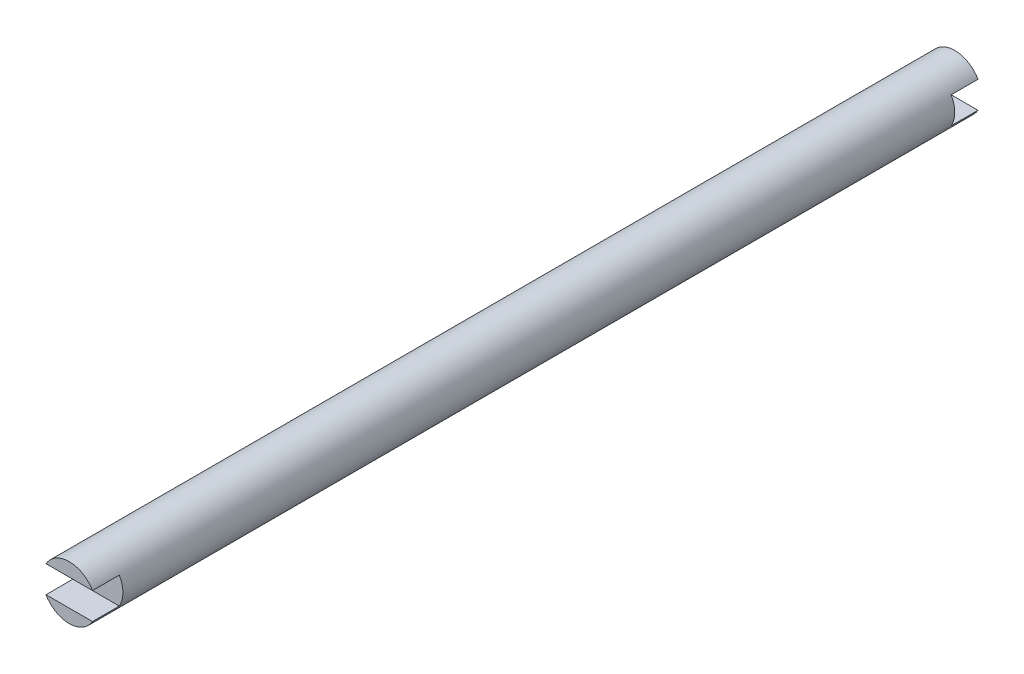
ISO-10303-21;
HEADER;
FILE_DESCRIPTION(('STEP AP214'),'2;1');
FILE_NAME('part.step','',(''),(''),'','','');
FILE_SCHEMA(('AUTOMOTIVE_DESIGN { 1 0 10303 214 1 1 1 1 }'));
ENDSEC;
DATA;
#1=APPLICATION_CONTEXT('core data for automotive mechanical design processes');
#2=APPLICATION_PROTOCOL_DEFINITION('international standard','automotive_design',2000,#1);
#3=PRODUCT_CONTEXT('',#1,'mechanical');
#4=PRODUCT('Part','Part','',(#3));
#5=PRODUCT_RELATED_PRODUCT_CATEGORY('part','',(#4));
#6=PRODUCT_DEFINITION_FORMATION('','',#4);
#7=PRODUCT_DEFINITION_CONTEXT('part definition',#1,'design');
#8=PRODUCT_DEFINITION('design','',#6,#7);
#9=PRODUCT_DEFINITION_SHAPE('','',#8);
#10=(LENGTH_UNIT() NAMED_UNIT(*) SI_UNIT(.MILLI.,.METRE.));
#11=(NAMED_UNIT(*) PLANE_ANGLE_UNIT() SI_UNIT($,.RADIAN.));
#12=(NAMED_UNIT(*) SI_UNIT($,.STERADIAN.) SOLID_ANGLE_UNIT());
#13=UNCERTAINTY_MEASURE_WITH_UNIT(LENGTH_MEASURE(1.E-05),#10,'distance_accuracy_value','');
#14=(GEOMETRIC_REPRESENTATION_CONTEXT(3) GLOBAL_UNCERTAINTY_ASSIGNED_CONTEXT((#13)) GLOBAL_UNIT_ASSIGNED_CONTEXT((#10,
#11,#12)) REPRESENTATION_CONTEXT('',''));
#15=CARTESIAN_POINT('',(0.,0.,0.));
#16=DIRECTION('',(0.,0.,1.));
#17=DIRECTION('',(1.,0.,0.));
#18=AXIS2_PLACEMENT_3D('',#15,#16,#17);
#19=CARTESIAN_POINT('',(0.,0.,0.));
#20=DIRECTION('',(0.,0.,1.));
#21=DIRECTION('',(1.,0.,0.));
#22=AXIS2_PLACEMENT_3D('',#19,#20,#21);
#23=PLANE('',#22);
#24=CARTESIAN_POINT('',(0.,0.,0.));
#25=DIRECTION('',(0.,0.,1.));
#26=DIRECTION('',(1.,0.,0.));
#27=AXIS2_PLACEMENT_3D('',#24,#25,#26);
#28=CIRCLE('',#27,2.);
#29=CARTESIAN_POINT('',(-1.73205080756888,-0.999999999999999,0.));
#30=VERTEX_POINT('',#29);
#31=CARTESIAN_POINT('',(1.73205080756888,-0.999999999999999,0.));
#32=VERTEX_POINT('',#31);
#33=EDGE_CURVE('E116',#30,#32,#28,.T.);
#34=ORIENTED_EDGE('',*,*,#33,.F.);
#35=DIRECTION('',(1.,0.,0.));
#36=VECTOR('',#35,1.);
#37=CARTESIAN_POINT('',(0.,-0.999999999999999,0.));
#38=LINE('',#37,#36);
#39=EDGE_CURVE('E103',#30,#32,#38,.T.);
#40=ORIENTED_EDGE('',*,*,#39,.T.);
#41=EDGE_LOOP('',(#34,#40));
#42=FACE_BOUND('',#41,.T.);
#43=ADVANCED_FACE('F32',(#42),#23,.F.);
#44=CARTESIAN_POINT('',(0.,0.,66.));
#45=DIRECTION('',(0.,0.,1.));
#46=DIRECTION('',(1.,0.,0.));
#47=AXIS2_PLACEMENT_3D('',#44,#45,#46);
#48=PLANE('',#47);
#49=DIRECTION('',(-1.,0.,0.));
#50=VECTOR('',#49,1.);
#51=CARTESIAN_POINT('',(0.,1.,66.));
#52=LINE('',#51,#50);
#53=CARTESIAN_POINT('',(1.73205080756888,1.,66.));
#54=VERTEX_POINT('',#53);
#55=CARTESIAN_POINT('',(-1.73205080756888,1.,66.));
#56=VERTEX_POINT('',#55);
#57=EDGE_CURVE('E126',#54,#56,#52,.T.);
#58=ORIENTED_EDGE('',*,*,#57,.F.);
#59=CARTESIAN_POINT('',(0.,0.,66.));
#60=DIRECTION('',(0.,0.,1.));
#61=DIRECTION('',(1.,0.,0.));
#62=AXIS2_PLACEMENT_3D('',#59,#60,#61);
#63=CIRCLE('',#62,2.);
#64=EDGE_CURVE('E119',#54,#56,#63,.T.);
#65=ORIENTED_EDGE('',*,*,#64,.T.);
#66=EDGE_LOOP('',(#58,#65));
#67=FACE_BOUND('',#66,.T.);
#68=ADVANCED_FACE('F169',(#67),#48,.T.);
#69=CARTESIAN_POINT('',(0.,0.,66.));
#70=DIRECTION('',(0.,0.,-1.));
#71=DIRECTION('',(-1.,0.,0.));
#72=AXIS2_PLACEMENT_3D('',#69,#70,#71);
#73=CYLINDRICAL_SURFACE('',#72,2.);
#74=ORIENTED_EDGE('',*,*,#33,.T.);
#75=DIRECTION('',(0.,0.,-1.));
#76=VECTOR('',#75,1.);
#77=CARTESIAN_POINT('',(1.73205080756888,-0.999999999999999,66.));
#78=LINE('',#77,#76);
#79=CARTESIAN_POINT('',(1.73205080756888,-0.999999999999999,2.));
#80=VERTEX_POINT('',#79);
#81=EDGE_CURVE('E112',#32,#80,#78,.F.);
#82=ORIENTED_EDGE('',*,*,#81,.T.);
#83=CARTESIAN_POINT('',(0.,0.,2.));
#84=DIRECTION('',(0.,0.,-1.));
#85=DIRECTION('',(-1.,0.,0.));
#86=AXIS2_PLACEMENT_3D('',#83,#84,#85);
#87=CIRCLE('',#86,2.);
#88=CARTESIAN_POINT('',(1.73205080756888,1.,2.));
#89=VERTEX_POINT('',#88);
#90=EDGE_CURVE('E11',#89,#80,#87,.T.);
#91=ORIENTED_EDGE('',*,*,#90,.F.);
#92=DIRECTION('',(0.,0.,-1.));
#93=VECTOR('',#92,1.);
#94=CARTESIAN_POINT('',(1.73205080756888,1.,66.));
#95=LINE('',#94,#93);
#96=CARTESIAN_POINT('',(1.73205080756888,1.,0.));
#97=VERTEX_POINT('',#96);
#98=EDGE_CURVE('E98',#89,#97,#95,.T.);
#99=ORIENTED_EDGE('',*,*,#98,.T.);
#100=CARTESIAN_POINT('',(-1.73205080756888,1.,0.));
#101=VERTEX_POINT('',#100);
#102=EDGE_CURVE('E110',#97,#101,#28,.T.);
#103=ORIENTED_EDGE('',*,*,#102,.T.);
#104=DIRECTION('',(0.,0.,-1.));
#105=VECTOR('',#104,1.);
#106=CARTESIAN_POINT('',(-1.73205080756888,1.,66.));
#107=LINE('',#106,#105);
#108=CARTESIAN_POINT('',(-1.73205080756888,1.,2.));
#109=VERTEX_POINT('',#108);
#110=EDGE_CURVE('E47',#101,#109,#107,.F.);
#111=ORIENTED_EDGE('',*,*,#110,.T.);
#112=CARTESIAN_POINT('',(-1.73205080756888,-0.999999999999999,2.));
#113=VERTEX_POINT('',#112);
#114=EDGE_CURVE('E36',#113,#109,#87,.T.);
#115=ORIENTED_EDGE('',*,*,#114,.F.);
#116=DIRECTION('',(0.,0.,-1.));
#117=VECTOR('',#116,1.);
#118=CARTESIAN_POINT('',(-1.73205080756888,-0.999999999999999,66.));
#119=LINE('',#118,#117);
#120=EDGE_CURVE('E145',#113,#30,#119,.T.);
#121=ORIENTED_EDGE('',*,*,#120,.T.);
#122=EDGE_LOOP('',(#74,#82,#91,#99,#103,#111,#115,#121));
#123=FACE_BOUND('',#122,.T.);
#124=CARTESIAN_POINT('',(0.,0.,64.));
#125=DIRECTION('',(0.,0.,1.));
#126=DIRECTION('',(1.,0.,0.));
#127=AXIS2_PLACEMENT_3D('',#124,#125,#126);
#128=CIRCLE('',#127,2.);
#129=CARTESIAN_POINT('',(-1.73205080756888,1.,64.));
#130=VERTEX_POINT('',#129);
#131=CARTESIAN_POINT('',(-1.73205080756888,-0.999999999999999,64.));
#132=VERTEX_POINT('',#131);
#133=EDGE_CURVE('E104',#130,#132,#128,.T.);
#134=ORIENTED_EDGE('',*,*,#133,.F.);
#135=DIRECTION('',(0.,0.,-1.));
#136=VECTOR('',#135,1.);
#137=CARTESIAN_POINT('',(-1.73205080756888,1.,66.));
#138=LINE('',#137,#136);
#139=EDGE_CURVE('E157',#130,#56,#138,.F.);
#140=ORIENTED_EDGE('',*,*,#139,.T.);
#141=ORIENTED_EDGE('',*,*,#64,.F.);
#142=DIRECTION('',(0.,0.,-1.));
#143=VECTOR('',#142,1.);
#144=CARTESIAN_POINT('',(1.73205080756888,1.,66.));
#145=LINE('',#144,#143);
#146=CARTESIAN_POINT('',(1.73205080756888,1.,64.));
#147=VERTEX_POINT('',#146);
#148=EDGE_CURVE('E121',#54,#147,#145,.T.);
#149=ORIENTED_EDGE('',*,*,#148,.T.);
#150=CARTESIAN_POINT('',(1.73205080756888,-0.999999999999999,64.));
#151=VERTEX_POINT('',#150);
#152=EDGE_CURVE('E128',#151,#147,#128,.T.);
#153=ORIENTED_EDGE('',*,*,#152,.F.);
#154=DIRECTION('',(0.,0.,-1.));
#155=VECTOR('',#154,1.);
#156=CARTESIAN_POINT('',(1.73205080756888,-0.999999999999999,66.));
#157=LINE('',#156,#155);
#158=CARTESIAN_POINT('',(1.73205080756888,-0.999999999999999,66.));
#159=VERTEX_POINT('',#158);
#160=EDGE_CURVE('E153',#151,#159,#157,.F.);
#161=ORIENTED_EDGE('',*,*,#160,.T.);
#162=CARTESIAN_POINT('',(-1.73205080756888,-0.999999999999999,66.));
#163=VERTEX_POINT('',#162);
#164=EDGE_CURVE('E115',#163,#159,#63,.T.);
#165=ORIENTED_EDGE('',*,*,#164,.F.);
#166=DIRECTION('',(0.,0.,-1.));
#167=VECTOR('',#166,1.);
#168=CARTESIAN_POINT('',(-1.73205080756888,-0.999999999999999,66.));
#169=LINE('',#168,#167);
#170=EDGE_CURVE('E55',#163,#132,#169,.T.);
#171=ORIENTED_EDGE('',*,*,#170,.T.);
#172=EDGE_LOOP('',(#134,#140,#141,#149,#153,#161,#165,#171));
#173=FACE_BOUND('',#172,.T.);
#174=ADVANCED_FACE('F34',(#123,#173),#73,.T.);
#175=DIRECTION('',(1.,0.,0.));
#176=VECTOR('',#175,1.);
#177=CARTESIAN_POINT('',(0.,-0.999999999999999,66.));
#178=LINE('',#177,#176);
#179=EDGE_CURVE('E124',#163,#159,#178,.T.);
#180=ORIENTED_EDGE('',*,*,#179,.F.);
#181=ORIENTED_EDGE('',*,*,#164,.T.);
#182=EDGE_LOOP('',(#180,#181));
#183=FACE_BOUND('',#182,.T.);
#184=ADVANCED_FACE('F172',(#183),#48,.T.);
#185=ORIENTED_EDGE('',*,*,#102,.F.);
#186=DIRECTION('',(-1.,0.,0.));
#187=VECTOR('',#186,1.);
#188=CARTESIAN_POINT('',(0.,1.,0.));
#189=LINE('',#188,#187);
#190=EDGE_CURVE('E95',#97,#101,#189,.T.);
#191=ORIENTED_EDGE('',*,*,#190,.T.);
#192=EDGE_LOOP('',(#185,#191));
#193=FACE_BOUND('',#192,.T.);
#194=ADVANCED_FACE('F114',(#193),#23,.F.);
#195=CARTESIAN_POINT('',(0.,0.,64.));
#196=DIRECTION('',(0.,0.,1.));
#197=DIRECTION('',(1.,0.,0.));
#198=AXIS2_PLACEMENT_3D('',#195,#196,#197);
#199=PLANE('',#198);
#200=ORIENTED_EDGE('',*,*,#133,.T.);
#201=DIRECTION('',(1.,0.,0.));
#202=VECTOR('',#201,1.);
#203=CARTESIAN_POINT('',(-3.75,-0.999999999999999,64.));
#204=LINE('',#203,#202);
#205=EDGE_CURVE('E147',#132,#151,#204,.T.);
#206=ORIENTED_EDGE('',*,*,#205,.T.);
#207=ORIENTED_EDGE('',*,*,#152,.T.);
#208=DIRECTION('',(-1.,0.,0.));
#209=VECTOR('',#208,1.);
#210=CARTESIAN_POINT('',(-3.75,1.,64.));
#211=LINE('',#210,#209);
#212=EDGE_CURVE('E150',#147,#130,#211,.T.);
#213=ORIENTED_EDGE('',*,*,#212,.T.);
#214=EDGE_LOOP('',(#200,#206,#207,#213));
#215=FACE_BOUND('',#214,.T.);
#216=ADVANCED_FACE('F183',(#215),#199,.T.);
#217=CARTESIAN_POINT('',(-3.75,1.,64.));
#218=DIRECTION('',(0.,1.,0.));
#219=DIRECTION('',(0.,0.,1.));
#220=AXIS2_PLACEMENT_3D('',#217,#218,#219);
#221=PLANE('',#220);
#222=ORIENTED_EDGE('',*,*,#57,.T.);
#223=ORIENTED_EDGE('',*,*,#139,.F.);
#224=ORIENTED_EDGE('',*,*,#212,.F.);
#225=ORIENTED_EDGE('',*,*,#148,.F.);
#226=EDGE_LOOP('',(#222,#223,#224,#225));
#227=FACE_BOUND('',#226,.T.);
#228=ADVANCED_FACE('F167',(#227),#221,.F.);
#229=CARTESIAN_POINT('',(-3.75,-0.999999999999999,64.));
#230=DIRECTION('',(0.,-1.,0.));
#231=DIRECTION('',(0.,0.,-1.));
#232=AXIS2_PLACEMENT_3D('',#229,#230,#231);
#233=PLANE('',#232);
#234=ORIENTED_EDGE('',*,*,#179,.T.);
#235=ORIENTED_EDGE('',*,*,#160,.F.);
#236=ORIENTED_EDGE('',*,*,#205,.F.);
#237=ORIENTED_EDGE('',*,*,#170,.F.);
#238=EDGE_LOOP('',(#234,#235,#236,#237));
#239=FACE_BOUND('',#238,.T.);
#240=ADVANCED_FACE('F185',(#239),#233,.F.);
#241=CARTESIAN_POINT('',(0.,0.,2.));
#242=DIRECTION('',(0.,0.,-1.));
#243=DIRECTION('',(-1.,0.,0.));
#244=AXIS2_PLACEMENT_3D('',#241,#242,#243);
#245=PLANE('',#244);
#246=ORIENTED_EDGE('',*,*,#90,.T.);
#247=DIRECTION('',(-1.,0.,0.));
#248=VECTOR('',#247,1.);
#249=CARTESIAN_POINT('',(3.75,-0.999999999999999,2.));
#250=LINE('',#249,#248);
#251=EDGE_CURVE('E138',#80,#113,#250,.T.);
#252=ORIENTED_EDGE('',*,*,#251,.T.);
#253=ORIENTED_EDGE('',*,*,#114,.T.);
#254=DIRECTION('',(1.,0.,0.));
#255=VECTOR('',#254,1.);
#256=CARTESIAN_POINT('',(-3.75,1.,2.));
#257=LINE('',#256,#255);
#258=EDGE_CURVE('E136',#109,#89,#257,.T.);
#259=ORIENTED_EDGE('',*,*,#258,.T.);
#260=EDGE_LOOP('',(#246,#252,#253,#259));
#261=FACE_BOUND('',#260,.T.);
#262=ADVANCED_FACE('F135',(#261),#245,.T.);
#263=CARTESIAN_POINT('',(3.75,-0.999999999999999,2.));
#264=DIRECTION('',(0.,-1.,0.));
#265=DIRECTION('',(0.,0.,-1.));
#266=AXIS2_PLACEMENT_3D('',#263,#264,#265);
#267=PLANE('',#266);
#268=ORIENTED_EDGE('',*,*,#251,.F.);
#269=ORIENTED_EDGE('',*,*,#81,.F.);
#270=ORIENTED_EDGE('',*,*,#39,.F.);
#271=ORIENTED_EDGE('',*,*,#120,.F.);
#272=EDGE_LOOP('',(#268,#269,#270,#271));
#273=FACE_BOUND('',#272,.T.);
#274=ADVANCED_FACE('F199',(#273),#267,.F.);
#275=CARTESIAN_POINT('',(-3.75,1.,2.));
#276=DIRECTION('',(0.,1.,0.));
#277=DIRECTION('',(0.,0.,1.));
#278=AXIS2_PLACEMENT_3D('',#275,#276,#277);
#279=PLANE('',#278);
#280=ORIENTED_EDGE('',*,*,#258,.F.);
#281=ORIENTED_EDGE('',*,*,#110,.F.);
#282=ORIENTED_EDGE('',*,*,#190,.F.);
#283=ORIENTED_EDGE('',*,*,#98,.F.);
#284=EDGE_LOOP('',(#280,#281,#282,#283));
#285=FACE_BOUND('',#284,.T.);
#286=ADVANCED_FACE('F97',(#285),#279,.F.);
#287=CLOSED_SHELL('',(#43,#68,#174,#184,#194,#216,#228,#240,#262,#274,#286));
#288=MANIFOLD_SOLID_BREP('B2',#287);
#289=ADVANCED_BREP_SHAPE_REPRESENTATION('',(#18,#288),#14);
#290=SHAPE_DEFINITION_REPRESENTATION(#9,#289);
ENDSEC;
END-ISO-10303-21;
